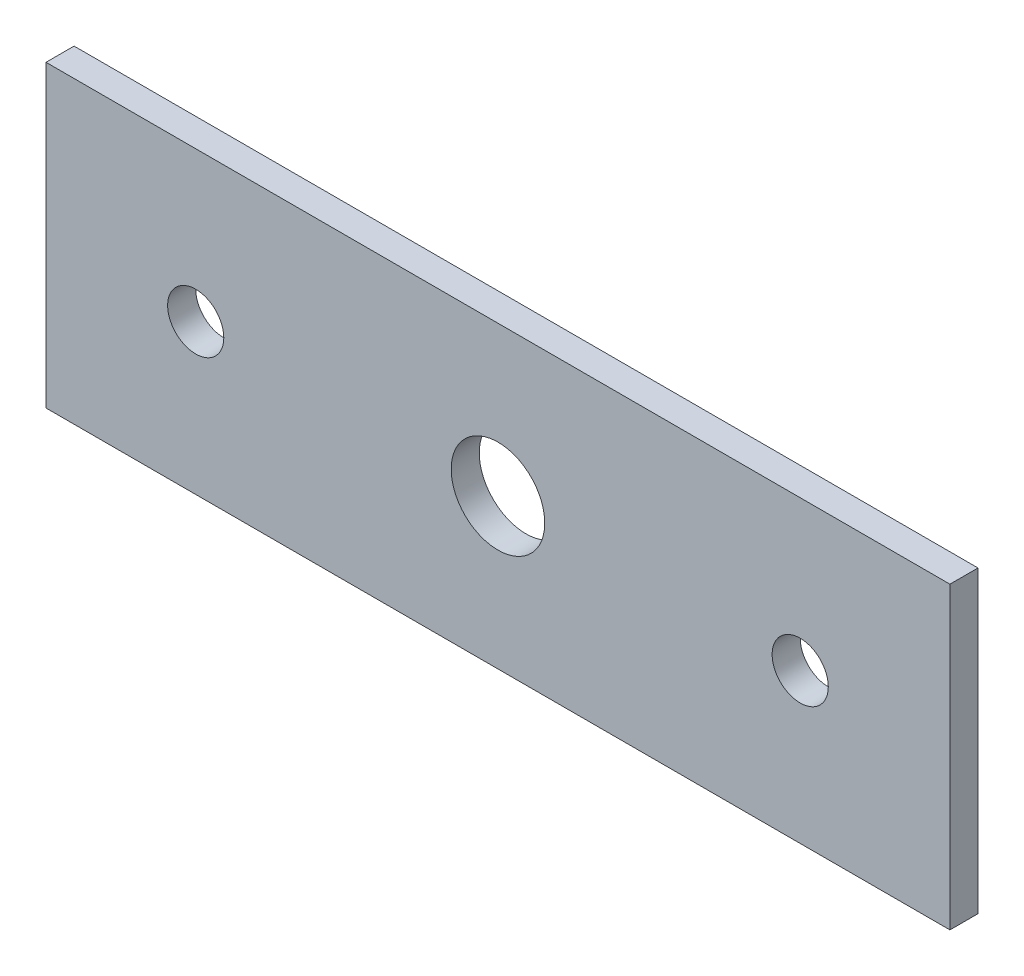
ISO-10303-21;
HEADER;
FILE_DESCRIPTION(('STEP AP214'),'2;1');
FILE_NAME('part.step','',(''),(''),'','','');
FILE_SCHEMA(('AUTOMOTIVE_DESIGN { 1 0 10303 214 1 1 1 1 }'));
ENDSEC;
DATA;
#1=APPLICATION_CONTEXT('core data for automotive mechanical design processes');
#2=APPLICATION_PROTOCOL_DEFINITION('international standard','automotive_design',2000,#1);
#3=PRODUCT_CONTEXT('',#1,'mechanical');
#4=PRODUCT('Part','Part','',(#3));
#5=PRODUCT_RELATED_PRODUCT_CATEGORY('part','',(#4));
#6=PRODUCT_DEFINITION_FORMATION('','',#4);
#7=PRODUCT_DEFINITION_CONTEXT('part definition',#1,'design');
#8=PRODUCT_DEFINITION('design','',#6,#7);
#9=PRODUCT_DEFINITION_SHAPE('','',#8);
#10=(LENGTH_UNIT() NAMED_UNIT(*) SI_UNIT(.MILLI.,.METRE.));
#11=(NAMED_UNIT(*) PLANE_ANGLE_UNIT() SI_UNIT($,.RADIAN.));
#12=(NAMED_UNIT(*) SI_UNIT($,.STERADIAN.) SOLID_ANGLE_UNIT());
#13=UNCERTAINTY_MEASURE_WITH_UNIT(LENGTH_MEASURE(1.E-05),#10,'distance_accuracy_value','');
#14=(GEOMETRIC_REPRESENTATION_CONTEXT(3) GLOBAL_UNCERTAINTY_ASSIGNED_CONTEXT((#13)) GLOBAL_UNIT_ASSIGNED_CONTEXT((#10,
#11,#12)) REPRESENTATION_CONTEXT('',''));
#15=CARTESIAN_POINT('',(0.,0.,0.));
#16=DIRECTION('',(0.,0.,1.));
#17=DIRECTION('',(1.,0.,0.));
#18=AXIS2_PLACEMENT_3D('',#15,#16,#17);
#19=CARTESIAN_POINT('',(-19.8824614450658,16.6713286713287,3.));
#20=DIRECTION('',(1.,0.,0.));
#21=DIRECTION('',(0.,0.,-1.));
#22=AXIS2_PLACEMENT_3D('',#19,#20,#21);
#23=PLANE('',#22);
#24=DIRECTION('',(0.,-1.,0.));
#25=VECTOR('',#24,1.);
#26=CARTESIAN_POINT('',(-19.8824614450658,16.6713286713287,0.));
#27=LINE('',#26,#25);
#28=CARTESIAN_POINT('',(-19.8824614450658,16.6713286713287,0.));
#29=VERTEX_POINT('',#28);
#30=CARTESIAN_POINT('',(-19.8824614450658,-15.3286713286713,0.));
#31=VERTEX_POINT('',#30);
#32=EDGE_CURVE('E107',#29,#31,#27,.T.);
#33=ORIENTED_EDGE('',*,*,#32,.T.);
#34=DIRECTION('',(0.,0.,-1.));
#35=VECTOR('',#34,1.);
#36=CARTESIAN_POINT('',(-19.8824614450658,-15.3286713286713,3.));
#37=LINE('',#36,#35);
#38=CARTESIAN_POINT('',(-19.8824614450658,-15.3286713286713,3.));
#39=VERTEX_POINT('',#38);
#40=EDGE_CURVE('E11',#39,#31,#37,.T.);
#41=ORIENTED_EDGE('',*,*,#40,.F.);
#42=DIRECTION('',(0.,-1.,0.));
#43=VECTOR('',#42,1.);
#44=CARTESIAN_POINT('',(-19.8824614450658,16.6713286713287,3.));
#45=LINE('',#44,#43);
#46=CARTESIAN_POINT('',(-19.8824614450658,16.6713286713287,3.));
#47=VERTEX_POINT('',#46);
#48=EDGE_CURVE('E91',#47,#39,#45,.T.);
#49=ORIENTED_EDGE('',*,*,#48,.F.);
#50=DIRECTION('',(0.,0.,-1.));
#51=VECTOR('',#50,1.);
#52=CARTESIAN_POINT('',(-19.8824614450658,16.6713286713287,3.));
#53=LINE('',#52,#51);
#54=EDGE_CURVE('E103',#47,#29,#53,.T.);
#55=ORIENTED_EDGE('',*,*,#54,.T.);
#56=EDGE_LOOP('',(#33,#41,#49,#55));
#57=FACE_BOUND('',#56,.T.);
#58=ADVANCED_FACE('F39',(#57),#23,.F.);
#59=CARTESIAN_POINT('',(-19.8824614450658,-15.3286713286713,3.));
#60=DIRECTION('',(0.,1.,0.));
#61=DIRECTION('',(-1.,0.,0.));
#62=AXIS2_PLACEMENT_3D('',#59,#60,#61);
#63=PLANE('',#62);
#64=DIRECTION('',(1.,0.,0.));
#65=VECTOR('',#64,1.);
#66=CARTESIAN_POINT('',(-19.8824614450658,-15.3286713286713,0.));
#67=LINE('',#66,#65);
#68=CARTESIAN_POINT('',(76.7175385549342,-15.3286713286713,0.));
#69=VERTEX_POINT('',#68);
#70=EDGE_CURVE('E96',#31,#69,#67,.T.);
#71=ORIENTED_EDGE('',*,*,#70,.T.);
#72=DIRECTION('',(0.,0.,-1.));
#73=VECTOR('',#72,1.);
#74=CARTESIAN_POINT('',(76.7175385549342,-15.3286713286713,3.));
#75=LINE('',#74,#73);
#76=CARTESIAN_POINT('',(76.7175385549342,-15.3286713286713,3.));
#77=VERTEX_POINT('',#76);
#78=EDGE_CURVE('E48',#77,#69,#75,.T.);
#79=ORIENTED_EDGE('',*,*,#78,.F.);
#80=DIRECTION('',(1.,0.,0.));
#81=VECTOR('',#80,1.);
#82=CARTESIAN_POINT('',(-19.8824614450658,-15.3286713286713,3.));
#83=LINE('',#82,#81);
#84=EDGE_CURVE('E86',#39,#77,#83,.T.);
#85=ORIENTED_EDGE('',*,*,#84,.F.);
#86=ORIENTED_EDGE('',*,*,#40,.T.);
#87=EDGE_LOOP('',(#71,#79,#85,#86));
#88=FACE_BOUND('',#87,.T.);
#89=ADVANCED_FACE('F95',(#88),#63,.F.);
#90=CARTESIAN_POINT('',(76.7175385549342,16.6713286713287,3.));
#91=DIRECTION('',(-1.,0.,0.));
#92=DIRECTION('',(0.,0.,1.));
#93=AXIS2_PLACEMENT_3D('',#90,#91,#92);
#94=PLANE('',#93);
#95=DIRECTION('',(0.,1.,0.));
#96=VECTOR('',#95,1.);
#97=CARTESIAN_POINT('',(76.7175385549342,16.6713286713287,0.));
#98=LINE('',#97,#96);
#99=CARTESIAN_POINT('',(76.7175385549342,16.6713286713287,0.));
#100=VERTEX_POINT('',#99);
#101=EDGE_CURVE('E73',#69,#100,#98,.T.);
#102=ORIENTED_EDGE('',*,*,#101,.T.);
#103=DIRECTION('',(0.,0.,-1.));
#104=VECTOR('',#103,1.);
#105=CARTESIAN_POINT('',(76.7175385549342,16.6713286713287,3.));
#106=LINE('',#105,#104);
#107=CARTESIAN_POINT('',(76.7175385549342,16.6713286713287,3.));
#108=VERTEX_POINT('',#107);
#109=EDGE_CURVE('E98',#108,#100,#106,.T.);
#110=ORIENTED_EDGE('',*,*,#109,.F.);
#111=DIRECTION('',(0.,1.,0.));
#112=VECTOR('',#111,1.);
#113=CARTESIAN_POINT('',(76.7175385549342,16.6713286713287,3.));
#114=LINE('',#113,#112);
#115=EDGE_CURVE('E89',#77,#108,#114,.T.);
#116=ORIENTED_EDGE('',*,*,#115,.F.);
#117=ORIENTED_EDGE('',*,*,#78,.T.);
#118=EDGE_LOOP('',(#102,#110,#116,#117));
#119=FACE_BOUND('',#118,.T.);
#120=ADVANCED_FACE('F99',(#119),#94,.F.);
#121=CARTESIAN_POINT('',(-19.8824614450658,16.6713286713287,3.));
#122=DIRECTION('',(0.,-1.,0.));
#123=DIRECTION('',(0.,0.,-1.));
#124=AXIS2_PLACEMENT_3D('',#121,#122,#123);
#125=PLANE('',#124);
#126=DIRECTION('',(-1.,0.,0.));
#127=VECTOR('',#126,1.);
#128=CARTESIAN_POINT('',(-19.8824614450658,16.6713286713287,0.));
#129=LINE('',#128,#127);
#130=EDGE_CURVE('E79',#100,#29,#129,.T.);
#131=ORIENTED_EDGE('',*,*,#130,.T.);
#132=ORIENTED_EDGE('',*,*,#54,.F.);
#133=DIRECTION('',(-1.,0.,0.));
#134=VECTOR('',#133,1.);
#135=CARTESIAN_POINT('',(-19.8824614450658,16.6713286713287,3.));
#136=LINE('',#135,#134);
#137=EDGE_CURVE('E56',#108,#47,#136,.T.);
#138=ORIENTED_EDGE('',*,*,#137,.F.);
#139=ORIENTED_EDGE('',*,*,#109,.T.);
#140=EDGE_LOOP('',(#131,#132,#138,#139));
#141=FACE_BOUND('',#140,.T.);
#142=ADVANCED_FACE('F121',(#141),#125,.F.);
#143=CARTESIAN_POINT('',(0.,0.,3.));
#144=DIRECTION('',(0.,0.,1.));
#145=DIRECTION('',(1.,0.,0.));
#146=AXIS2_PLACEMENT_3D('',#143,#144,#145);
#147=PLANE('',#146);
#148=CARTESIAN_POINT('',(-3.8824614450658,0.671328671328672,3.));
#149=DIRECTION('',(0.,0.,1.));
#150=DIRECTION('',(1.,0.,0.));
#151=AXIS2_PLACEMENT_3D('',#148,#149,#150);
#152=CIRCLE('',#151,3.);
#153=CARTESIAN_POINT('',(-0.882461445065796,0.671328671328672,3.));
#154=VERTEX_POINT('',#153);
#155=EDGE_CURVE('E144',#154,#154,#152,.T.);
#156=ORIENTED_EDGE('',*,*,#155,.F.);
#157=EDGE_LOOP('',(#156));
#158=FACE_BOUND('',#157,.T.);
#159=CARTESIAN_POINT('',(60.7175385549342,0.671328671328672,3.));
#160=DIRECTION('',(0.,0.,1.));
#161=DIRECTION('',(1.,0.,0.));
#162=AXIS2_PLACEMENT_3D('',#159,#160,#161);
#163=CIRCLE('',#162,3.00000000000001);
#164=CARTESIAN_POINT('',(63.7175385549342,0.671328671328672,3.));
#165=VERTEX_POINT('',#164);
#166=EDGE_CURVE('E136',#165,#165,#163,.T.);
#167=ORIENTED_EDGE('',*,*,#166,.F.);
#168=EDGE_LOOP('',(#167));
#169=FACE_BOUND('',#168,.T.);
#170=CARTESIAN_POINT('',(28.4175385549342,0.671328671328673,3.));
#171=DIRECTION('',(0.,0.,1.));
#172=DIRECTION('',(1.,0.,0.));
#173=AXIS2_PLACEMENT_3D('',#170,#171,#172);
#174=CIRCLE('',#173,4.99999999999999);
#175=CARTESIAN_POINT('',(33.4175385549342,0.671328671328673,3.));
#176=VERTEX_POINT('',#175);
#177=EDGE_CURVE('E128',#176,#176,#174,.T.);
#178=ORIENTED_EDGE('',*,*,#177,.F.);
#179=EDGE_LOOP('',(#178));
#180=FACE_BOUND('',#179,.T.);
#181=ORIENTED_EDGE('',*,*,#48,.T.);
#182=ORIENTED_EDGE('',*,*,#84,.T.);
#183=ORIENTED_EDGE('',*,*,#115,.T.);
#184=ORIENTED_EDGE('',*,*,#137,.T.);
#185=EDGE_LOOP('',(#181,#182,#183,#184));
#186=FACE_BOUND('',#185,.T.);
#187=ADVANCED_FACE('F87',(#158,#169,#180,#186),#147,.T.);
#188=CARTESIAN_POINT('',(0.,0.,0.));
#189=DIRECTION('',(0.,0.,1.));
#190=DIRECTION('',(1.,0.,0.));
#191=AXIS2_PLACEMENT_3D('',#188,#189,#190);
#192=PLANE('',#191);
#193=CARTESIAN_POINT('',(-3.8824614450658,0.671328671328672,0.));
#194=DIRECTION('',(0.,0.,1.));
#195=DIRECTION('',(1.,0.,0.));
#196=AXIS2_PLACEMENT_3D('',#193,#194,#195);
#197=CIRCLE('',#196,3.);
#198=CARTESIAN_POINT('',(-0.882461445065796,0.671328671328672,0.));
#199=VERTEX_POINT('',#198);
#200=EDGE_CURVE('E111',#199,#199,#197,.T.);
#201=ORIENTED_EDGE('',*,*,#200,.T.);
#202=EDGE_LOOP('',(#201));
#203=FACE_BOUND('',#202,.T.);
#204=CARTESIAN_POINT('',(60.7175385549342,0.671328671328672,0.));
#205=DIRECTION('',(0.,0.,1.));
#206=DIRECTION('',(1.,0.,0.));
#207=AXIS2_PLACEMENT_3D('',#204,#205,#206);
#208=CIRCLE('',#207,3.00000000000001);
#209=CARTESIAN_POINT('',(63.7175385549342,0.671328671328672,0.));
#210=VERTEX_POINT('',#209);
#211=EDGE_CURVE('E140',#210,#210,#208,.T.);
#212=ORIENTED_EDGE('',*,*,#211,.T.);
#213=EDGE_LOOP('',(#212));
#214=FACE_BOUND('',#213,.T.);
#215=CARTESIAN_POINT('',(28.4175385549342,0.671328671328673,0.));
#216=DIRECTION('',(0.,0.,1.));
#217=DIRECTION('',(1.,0.,0.));
#218=AXIS2_PLACEMENT_3D('',#215,#216,#217);
#219=CIRCLE('',#218,4.99999999999999);
#220=CARTESIAN_POINT('',(33.4175385549342,0.671328671328673,0.));
#221=VERTEX_POINT('',#220);
#222=EDGE_CURVE('E132',#221,#221,#219,.T.);
#223=ORIENTED_EDGE('',*,*,#222,.T.);
#224=EDGE_LOOP('',(#223));
#225=FACE_BOUND('',#224,.T.);
#226=ORIENTED_EDGE('',*,*,#32,.F.);
#227=ORIENTED_EDGE('',*,*,#130,.F.);
#228=ORIENTED_EDGE('',*,*,#101,.F.);
#229=ORIENTED_EDGE('',*,*,#70,.F.);
#230=EDGE_LOOP('',(#226,#227,#228,#229));
#231=FACE_BOUND('',#230,.T.);
#232=ADVANCED_FACE('F124',(#203,#214,#225,#231),#192,.F.);
#233=CARTESIAN_POINT('',(28.4175385549342,0.671328671328673,0.));
#234=DIRECTION('',(0.,0.,1.));
#235=DIRECTION('',(1.,0.,0.));
#236=AXIS2_PLACEMENT_3D('',#233,#234,#235);
#237=CYLINDRICAL_SURFACE('',#236,4.99999999999999);
#238=ORIENTED_EDGE('',*,*,#222,.F.);
#239=EDGE_LOOP('',(#238));
#240=FACE_BOUND('',#239,.T.);
#241=ORIENTED_EDGE('',*,*,#177,.T.);
#242=EDGE_LOOP('',(#241));
#243=FACE_BOUND('',#242,.T.);
#244=ADVANCED_FACE('F168',(#240,#243),#237,.F.);
#245=CARTESIAN_POINT('',(60.7175385549342,0.671328671328672,0.));
#246=DIRECTION('',(0.,0.,1.));
#247=DIRECTION('',(1.,0.,0.));
#248=AXIS2_PLACEMENT_3D('',#245,#246,#247);
#249=CYLINDRICAL_SURFACE('',#248,3.00000000000001);
#250=ORIENTED_EDGE('',*,*,#211,.F.);
#251=EDGE_LOOP('',(#250));
#252=FACE_BOUND('',#251,.T.);
#253=ORIENTED_EDGE('',*,*,#166,.T.);
#254=EDGE_LOOP('',(#253));
#255=FACE_BOUND('',#254,.T.);
#256=ADVANCED_FACE('F157',(#252,#255),#249,.F.);
#257=CARTESIAN_POINT('',(-3.8824614450658,0.671328671328672,0.));
#258=DIRECTION('',(0.,0.,1.));
#259=DIRECTION('',(1.,0.,0.));
#260=AXIS2_PLACEMENT_3D('',#257,#258,#259);
#261=CYLINDRICAL_SURFACE('',#260,3.);
#262=ORIENTED_EDGE('',*,*,#200,.F.);
#263=EDGE_LOOP('',(#262));
#264=FACE_BOUND('',#263,.T.);
#265=ORIENTED_EDGE('',*,*,#155,.T.);
#266=EDGE_LOOP('',(#265));
#267=FACE_BOUND('',#266,.T.);
#268=ADVANCED_FACE('F154',(#264,#267),#261,.F.);
#269=CLOSED_SHELL('',(#58,#89,#120,#142,#187,#232,#244,#256,#268));
#270=MANIFOLD_SOLID_BREP('B2',#269);
#271=ADVANCED_BREP_SHAPE_REPRESENTATION('',(#18,#270),#14);
#272=SHAPE_DEFINITION_REPRESENTATION(#9,#271);
ENDSEC;
END-ISO-10303-21;
